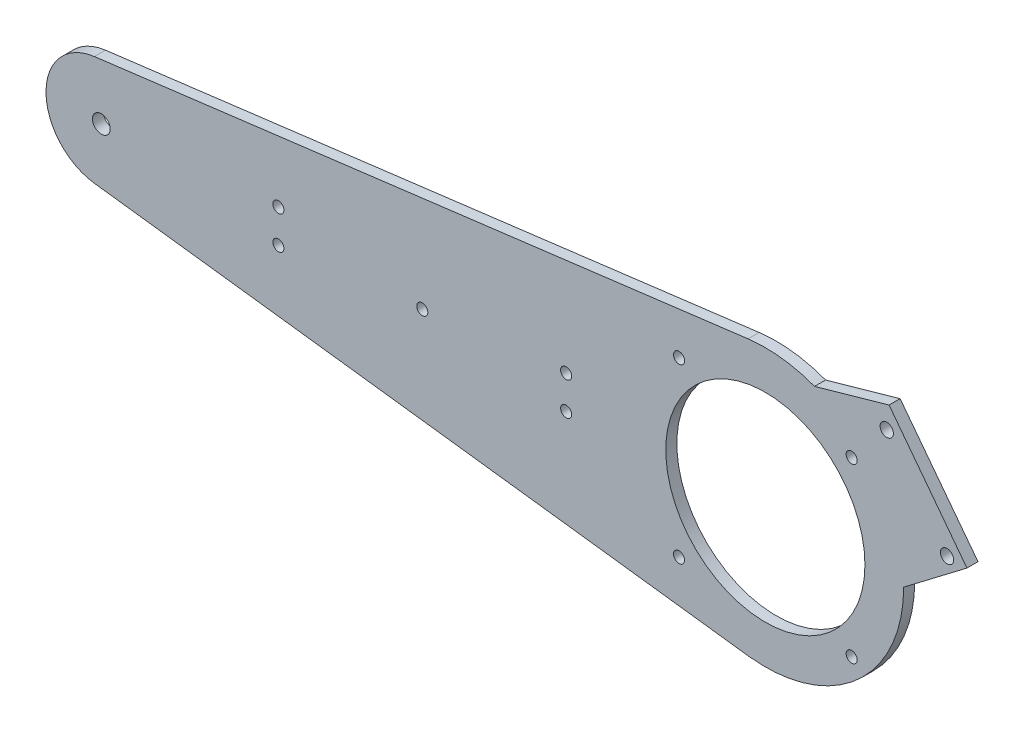
ISO-10303-21;
HEADER;
FILE_DESCRIPTION(('STEP AP214'),'2;1');
FILE_NAME('part.step','',(''),(''),'','','');
FILE_SCHEMA(('AUTOMOTIVE_DESIGN { 1 0 10303 214 1 1 1 1 }'));
ENDSEC;
DATA;
#1=APPLICATION_CONTEXT('core data for automotive mechanical design processes');
#2=APPLICATION_PROTOCOL_DEFINITION('international standard','automotive_design',2000,#1);
#3=PRODUCT_CONTEXT('',#1,'mechanical');
#4=PRODUCT('Part','Part','',(#3));
#5=PRODUCT_RELATED_PRODUCT_CATEGORY('part','',(#4));
#6=PRODUCT_DEFINITION_FORMATION('','',#4);
#7=PRODUCT_DEFINITION_CONTEXT('part definition',#1,'design');
#8=PRODUCT_DEFINITION('design','',#6,#7);
#9=PRODUCT_DEFINITION_SHAPE('','',#8);
#10=(LENGTH_UNIT() NAMED_UNIT(*) SI_UNIT(.MILLI.,.METRE.));
#11=(NAMED_UNIT(*) PLANE_ANGLE_UNIT() SI_UNIT($,.RADIAN.));
#12=(NAMED_UNIT(*) SI_UNIT($,.STERADIAN.) SOLID_ANGLE_UNIT());
#13=UNCERTAINTY_MEASURE_WITH_UNIT(LENGTH_MEASURE(1.E-05),#10,'distance_accuracy_value','');
#14=(GEOMETRIC_REPRESENTATION_CONTEXT(3) GLOBAL_UNCERTAINTY_ASSIGNED_CONTEXT((#13)) GLOBAL_UNIT_ASSIGNED_CONTEXT((#10,
#11,#12)) REPRESENTATION_CONTEXT('',''));
#15=CARTESIAN_POINT('',(0.,0.,0.));
#16=DIRECTION('',(0.,0.,1.));
#17=DIRECTION('',(1.,0.,0.));
#18=AXIS2_PLACEMENT_3D('',#15,#16,#17);
#19=CARTESIAN_POINT('',(0.,0.,5.));
#20=DIRECTION('',(0.,0.,-1.));
#21=DIRECTION('',(-1.,0.,0.));
#22=AXIS2_PLACEMENT_3D('',#19,#20,#21);
#23=CYLINDRICAL_SURFACE('',#22,62.5);
#24=CARTESIAN_POINT('',(0.,0.,5.));
#25=DIRECTION('',(0.,0.,1.));
#26=DIRECTION('',(1.,0.,0.));
#27=AXIS2_PLACEMENT_3D('',#24,#25,#26);
#28=CIRCLE('',#27,62.5);
#29=CARTESIAN_POINT('',(22.2187703705802,58.4172598058094,5.));
#30=VERTEX_POINT('',#29);
#31=CARTESIAN_POINT('',(-7.81249999999999,62.0097963530763,5.));
#32=VERTEX_POINT('',#31);
#33=EDGE_CURVE('E60',#30,#32,#28,.T.);
#34=ORIENTED_EDGE('',*,*,#33,.F.);
#35=DIRECTION('',(0.,0.,-1.));
#36=VECTOR('',#35,1.);
#37=CARTESIAN_POINT('',(22.2187703705802,58.4172598058093,101.751849564614));
#38=LINE('',#37,#36);
#39=CARTESIAN_POINT('',(22.2187703705802,58.4172598058093,0.));
#40=VERTEX_POINT('',#39);
#41=EDGE_CURVE('E52',#30,#40,#38,.T.);
#42=ORIENTED_EDGE('',*,*,#41,.T.);
#43=CARTESIAN_POINT('',(0.,0.,0.));
#44=DIRECTION('',(0.,0.,1.));
#45=DIRECTION('',(1.,0.,0.));
#46=AXIS2_PLACEMENT_3D('',#43,#44,#45);
#47=CIRCLE('',#46,62.5);
#48=CARTESIAN_POINT('',(-7.81249999999999,62.0097963530763,0.));
#49=VERTEX_POINT('',#48);
#50=EDGE_CURVE('E81',#40,#49,#47,.T.);
#51=ORIENTED_EDGE('',*,*,#50,.T.);
#52=DIRECTION('',(0.,0.,-1.));
#53=VECTOR('',#52,1.);
#54=CARTESIAN_POINT('',(-7.81249999999999,62.0097963530763,5.));
#55=LINE('',#54,#53);
#56=EDGE_CURVE('E163',#32,#49,#55,.T.);
#57=ORIENTED_EDGE('',*,*,#56,.F.);
#58=EDGE_LOOP('',(#34,#42,#51,#57));
#59=FACE_BOUND('',#58,.T.);
#60=ADVANCED_FACE('F37',(#59),#23,.T.);
#61=CARTESIAN_POINT('',(-7.81249999999999,62.0097963530763,5.));
#62=DIRECTION('',(0.125,-0.992156741649222,0.));
#63=DIRECTION('',(0.992156741649222,0.125,0.));
#64=AXIS2_PLACEMENT_3D('',#61,#62,#63);
#65=PLANE('',#64);
#66=DIRECTION('',(-0.992156741649222,-0.125,0.));
#67=VECTOR('',#66,1.);
#68=CARTESIAN_POINT('',(-7.81249999999999,62.0097963530763,0.));
#69=LINE('',#68,#67);
#70=CARTESIAN_POINT('',(-303.125,24.8039185412306,0.));
#71=VERTEX_POINT('',#70);
#72=EDGE_CURVE('E173',#49,#71,#69,.T.);
#73=ORIENTED_EDGE('',*,*,#72,.T.);
#74=DIRECTION('',(0.,0.,-1.));
#75=VECTOR('',#74,1.);
#76=CARTESIAN_POINT('',(-303.125,24.8039185412306,5.));
#77=LINE('',#76,#75);
#78=CARTESIAN_POINT('',(-303.125,24.8039185412306,5.));
#79=VERTEX_POINT('',#78);
#80=EDGE_CURVE('E11',#79,#71,#77,.T.);
#81=ORIENTED_EDGE('',*,*,#80,.F.);
#82=DIRECTION('',(-0.992156741649222,-0.125,0.));
#83=VECTOR('',#82,1.);
#84=CARTESIAN_POINT('',(-7.81249999999999,62.0097963530763,5.));
#85=LINE('',#84,#83);
#86=EDGE_CURVE('E214',#32,#79,#85,.T.);
#87=ORIENTED_EDGE('',*,*,#86,.F.);
#88=ORIENTED_EDGE('',*,*,#56,.T.);
#89=EDGE_LOOP('',(#73,#81,#87,#88));
#90=FACE_BOUND('',#89,.T.);
#91=ADVANCED_FACE('F257',(#90),#65,.F.);
#92=CARTESIAN_POINT('',(-300.,0.,5.));
#93=DIRECTION('',(0.,0.,-1.));
#94=DIRECTION('',(-1.,0.,0.));
#95=AXIS2_PLACEMENT_3D('',#92,#93,#94);
#96=CYLINDRICAL_SURFACE('',#95,25.);
#97=CARTESIAN_POINT('',(-300.,0.,0.));
#98=DIRECTION('',(0.,0.,1.));
#99=DIRECTION('',(1.,0.,0.));
#100=AXIS2_PLACEMENT_3D('',#97,#98,#99);
#101=CIRCLE('',#100,25.);
#102=CARTESIAN_POINT('',(-303.125,-24.8039185412306,0.));
#103=VERTEX_POINT('',#102);
#104=EDGE_CURVE('E172',#71,#103,#101,.T.);
#105=ORIENTED_EDGE('',*,*,#104,.T.);
#106=DIRECTION('',(0.,0.,-1.));
#107=VECTOR('',#106,1.);
#108=CARTESIAN_POINT('',(-303.125,-24.8039185412306,5.));
#109=LINE('',#108,#107);
#110=CARTESIAN_POINT('',(-303.125,-24.8039185412306,5.));
#111=VERTEX_POINT('',#110);
#112=EDGE_CURVE('E45',#111,#103,#109,.T.);
#113=ORIENTED_EDGE('',*,*,#112,.F.);
#114=CARTESIAN_POINT('',(-300.,0.,5.));
#115=DIRECTION('',(0.,0.,1.));
#116=DIRECTION('',(1.,0.,0.));
#117=AXIS2_PLACEMENT_3D('',#114,#115,#116);
#118=CIRCLE('',#117,25.);
#119=EDGE_CURVE('E88',#79,#111,#118,.T.);
#120=ORIENTED_EDGE('',*,*,#119,.F.);
#121=ORIENTED_EDGE('',*,*,#80,.T.);
#122=EDGE_LOOP('',(#105,#113,#120,#121));
#123=FACE_BOUND('',#122,.T.);
#124=ADVANCED_FACE('F278',(#123),#96,.T.);
#125=CARTESIAN_POINT('',(-7.81249999999999,-62.0097963530763,5.));
#126=DIRECTION('',(0.125,0.992156741649222,0.));
#127=DIRECTION('',(-0.992156741649222,0.125,0.));
#128=AXIS2_PLACEMENT_3D('',#125,#126,#127);
#129=PLANE('',#128);
#130=DIRECTION('',(0.992156741649222,-0.125,0.));
#131=VECTOR('',#130,1.);
#132=CARTESIAN_POINT('',(-7.81249999999999,-62.0097963530763,0.));
#133=LINE('',#132,#131);
#134=CARTESIAN_POINT('',(-7.81249999999999,-62.0097963530763,0.));
#135=VERTEX_POINT('',#134);
#136=EDGE_CURVE('E144',#103,#135,#133,.T.);
#137=ORIENTED_EDGE('',*,*,#136,.T.);
#138=DIRECTION('',(0.,0.,-1.));
#139=VECTOR('',#138,1.);
#140=CARTESIAN_POINT('',(-7.81249999999999,-62.0097963530763,5.));
#141=LINE('',#140,#139);
#142=CARTESIAN_POINT('',(-7.81249999999999,-62.0097963530763,5.));
#143=VERTEX_POINT('',#142);
#144=EDGE_CURVE('E138',#143,#135,#141,.T.);
#145=ORIENTED_EDGE('',*,*,#144,.F.);
#146=DIRECTION('',(0.992156741649222,-0.125,0.));
#147=VECTOR('',#146,1.);
#148=CARTESIAN_POINT('',(-7.81249999999999,-62.0097963530763,5.));
#149=LINE('',#148,#147);
#150=EDGE_CURVE('E170',#111,#143,#149,.T.);
#151=ORIENTED_EDGE('',*,*,#150,.F.);
#152=ORIENTED_EDGE('',*,*,#112,.T.);
#153=EDGE_LOOP('',(#137,#145,#151,#152));
#154=FACE_BOUND('',#153,.T.);
#155=ADVANCED_FACE('F169',(#154),#129,.F.);
#156=CARTESIAN_POINT('',(39.,-39.,5.));
#157=DIRECTION('',(0.,0.,-1.));
#158=DIRECTION('',(-1.,0.,0.));
#159=AXIS2_PLACEMENT_3D('',#156,#157,#158);
#160=CYLINDRICAL_SURFACE('',#159,2.5);
#161=CARTESIAN_POINT('',(39.,-39.,5.));
#162=DIRECTION('',(0.,0.,1.));
#163=DIRECTION('',(1.,0.,0.));
#164=AXIS2_PLACEMENT_3D('',#161,#162,#163);
#165=CIRCLE('',#164,2.5);
#166=CARTESIAN_POINT('',(41.5,-39.,5.));
#167=VERTEX_POINT('',#166);
#168=EDGE_CURVE('E195',#167,#167,#165,.T.);
#169=ORIENTED_EDGE('',*,*,#168,.T.);
#170=EDGE_LOOP('',(#169));
#171=FACE_BOUND('',#170,.T.);
#172=CARTESIAN_POINT('',(39.,-39.,0.));
#173=DIRECTION('',(0.,0.,1.));
#174=DIRECTION('',(1.,0.,0.));
#175=AXIS2_PLACEMENT_3D('',#172,#173,#174);
#176=CIRCLE('',#175,2.5);
#177=CARTESIAN_POINT('',(41.5,-39.,0.));
#178=VERTEX_POINT('',#177);
#179=EDGE_CURVE('E156',#178,#178,#176,.T.);
#180=ORIENTED_EDGE('',*,*,#179,.F.);
#181=EDGE_LOOP('',(#180));
#182=FACE_BOUND('',#181,.T.);
#183=ADVANCED_FACE('F308',(#171,#182),#160,.F.);
#184=CARTESIAN_POINT('',(-39.,39.,5.));
#185=DIRECTION('',(0.,0.,-1.));
#186=DIRECTION('',(-1.,0.,0.));
#187=AXIS2_PLACEMENT_3D('',#184,#185,#186);
#188=CYLINDRICAL_SURFACE('',#187,2.5);
#189=CARTESIAN_POINT('',(-39.,39.,5.));
#190=DIRECTION('',(0.,0.,1.));
#191=DIRECTION('',(1.,0.,0.));
#192=AXIS2_PLACEMENT_3D('',#189,#190,#191);
#193=CIRCLE('',#192,2.5);
#194=CARTESIAN_POINT('',(-36.5,39.,5.));
#195=VERTEX_POINT('',#194);
#196=EDGE_CURVE('E198',#195,#195,#193,.T.);
#197=ORIENTED_EDGE('',*,*,#196,.T.);
#198=EDGE_LOOP('',(#197));
#199=FACE_BOUND('',#198,.T.);
#200=CARTESIAN_POINT('',(-39.,39.,0.));
#201=DIRECTION('',(0.,0.,1.));
#202=DIRECTION('',(1.,0.,0.));
#203=AXIS2_PLACEMENT_3D('',#200,#201,#202);
#204=CIRCLE('',#203,2.5);
#205=CARTESIAN_POINT('',(-36.5,39.,0.));
#206=VERTEX_POINT('',#205);
#207=EDGE_CURVE('E153',#206,#206,#204,.T.);
#208=ORIENTED_EDGE('',*,*,#207,.F.);
#209=EDGE_LOOP('',(#208));
#210=FACE_BOUND('',#209,.T.);
#211=ADVANCED_FACE('F304',(#199,#210),#188,.F.);
#212=CARTESIAN_POINT('',(39.,39.,5.));
#213=DIRECTION('',(0.,0.,-1.));
#214=DIRECTION('',(-1.,0.,0.));
#215=AXIS2_PLACEMENT_3D('',#212,#213,#214);
#216=CYLINDRICAL_SURFACE('',#215,2.5);
#217=CARTESIAN_POINT('',(39.,39.,5.));
#218=DIRECTION('',(0.,0.,1.));
#219=DIRECTION('',(1.,0.,0.));
#220=AXIS2_PLACEMENT_3D('',#217,#218,#219);
#221=CIRCLE('',#220,2.5);
#222=CARTESIAN_POINT('',(41.5,39.,5.));
#223=VERTEX_POINT('',#222);
#224=EDGE_CURVE('E201',#223,#223,#221,.T.);
#225=ORIENTED_EDGE('',*,*,#224,.T.);
#226=EDGE_LOOP('',(#225));
#227=FACE_BOUND('',#226,.T.);
#228=CARTESIAN_POINT('',(39.,39.,0.));
#229=DIRECTION('',(0.,0.,1.));
#230=DIRECTION('',(1.,0.,0.));
#231=AXIS2_PLACEMENT_3D('',#228,#229,#230);
#232=CIRCLE('',#231,2.5);
#233=CARTESIAN_POINT('',(41.5,39.,0.));
#234=VERTEX_POINT('',#233);
#235=EDGE_CURVE('E150',#234,#234,#232,.T.);
#236=ORIENTED_EDGE('',*,*,#235,.F.);
#237=EDGE_LOOP('',(#236));
#238=FACE_BOUND('',#237,.T.);
#239=ADVANCED_FACE('F297',(#227,#238),#216,.F.);
#240=CARTESIAN_POINT('',(-39.,-39.,5.));
#241=DIRECTION('',(0.,0.,-1.));
#242=DIRECTION('',(-1.,0.,0.));
#243=AXIS2_PLACEMENT_3D('',#240,#241,#242);
#244=CYLINDRICAL_SURFACE('',#243,2.5);
#245=CARTESIAN_POINT('',(-39.,-39.,5.));
#246=DIRECTION('',(0.,0.,1.));
#247=DIRECTION('',(1.,0.,0.));
#248=AXIS2_PLACEMENT_3D('',#245,#246,#247);
#249=CIRCLE('',#248,2.5);
#250=CARTESIAN_POINT('',(-36.5,-39.,5.));
#251=VERTEX_POINT('',#250);
#252=EDGE_CURVE('E204',#251,#251,#249,.T.);
#253=ORIENTED_EDGE('',*,*,#252,.T.);
#254=EDGE_LOOP('',(#253));
#255=FACE_BOUND('',#254,.T.);
#256=CARTESIAN_POINT('',(-39.,-39.,0.));
#257=DIRECTION('',(0.,0.,1.));
#258=DIRECTION('',(1.,0.,0.));
#259=AXIS2_PLACEMENT_3D('',#256,#257,#258);
#260=CIRCLE('',#259,2.5);
#261=CARTESIAN_POINT('',(-36.5,-39.,0.));
#262=VERTEX_POINT('',#261);
#263=EDGE_CURVE('E142',#262,#262,#260,.T.);
#264=ORIENTED_EDGE('',*,*,#263,.F.);
#265=EDGE_LOOP('',(#264));
#266=FACE_BOUND('',#265,.T.);
#267=ADVANCED_FACE('F292',(#255,#266),#244,.F.);
#268=CARTESIAN_POINT('',(0.,0.,5.));
#269=DIRECTION('',(0.,0.,-1.));
#270=DIRECTION('',(-1.,0.,0.));
#271=AXIS2_PLACEMENT_3D('',#268,#269,#270);
#272=CYLINDRICAL_SURFACE('',#271,45.);
#273=CARTESIAN_POINT('',(0.,0.,5.));
#274=DIRECTION('',(0.,0.,1.));
#275=DIRECTION('',(1.,0.,0.));
#276=AXIS2_PLACEMENT_3D('',#273,#274,#275);
#277=CIRCLE('',#276,45.);
#278=CARTESIAN_POINT('',(45.,0.,5.));
#279=VERTEX_POINT('',#278);
#280=EDGE_CURVE('E207',#279,#279,#277,.T.);
#281=ORIENTED_EDGE('',*,*,#280,.T.);
#282=EDGE_LOOP('',(#281));
#283=FACE_BOUND('',#282,.T.);
#284=CARTESIAN_POINT('',(0.,0.,0.));
#285=DIRECTION('',(0.,0.,1.));
#286=DIRECTION('',(1.,0.,0.));
#287=AXIS2_PLACEMENT_3D('',#284,#285,#286);
#288=CIRCLE('',#287,45.);
#289=CARTESIAN_POINT('',(45.,0.,0.));
#290=VERTEX_POINT('',#289);
#291=EDGE_CURVE('E139',#290,#290,#288,.T.);
#292=ORIENTED_EDGE('',*,*,#291,.F.);
#293=EDGE_LOOP('',(#292));
#294=FACE_BOUND('',#293,.T.);
#295=ADVANCED_FACE('F283',(#283,#294),#272,.F.);
#296=CARTESIAN_POINT('',(62.5,0.,0.));
#297=VERTEX_POINT('',#296);
#298=EDGE_CURVE('E129',#135,#297,#47,.T.);
#299=ORIENTED_EDGE('',*,*,#298,.T.);
#300=DIRECTION('',(0.,0.,-1.));
#301=VECTOR('',#300,1.);
#302=CARTESIAN_POINT('',(62.5,0.,101.751849564614));
#303=LINE('',#302,#301);
#304=CARTESIAN_POINT('',(62.5,0.,5.));
#305=VERTEX_POINT('',#304);
#306=EDGE_CURVE('E111',#305,#297,#303,.T.);
#307=ORIENTED_EDGE('',*,*,#306,.F.);
#308=EDGE_CURVE('E210',#143,#305,#28,.T.);
#309=ORIENTED_EDGE('',*,*,#308,.F.);
#310=ORIENTED_EDGE('',*,*,#144,.T.);
#311=EDGE_LOOP('',(#299,#307,#309,#310));
#312=FACE_BOUND('',#311,.T.);
#313=ADVANCED_FACE('F136',(#312),#23,.T.);
#314=CARTESIAN_POINT('',(-90.,7.5,5.));
#315=DIRECTION('',(0.,0.,-1.));
#316=DIRECTION('',(-1.,0.,0.));
#317=AXIS2_PLACEMENT_3D('',#314,#315,#316);
#318=CYLINDRICAL_SURFACE('',#317,2.49999999999999);
#319=CARTESIAN_POINT('',(-90.,7.5,5.));
#320=DIRECTION('',(0.,0.,1.));
#321=DIRECTION('',(1.,0.,0.));
#322=AXIS2_PLACEMENT_3D('',#319,#320,#321);
#323=CIRCLE('',#322,2.49999999999999);
#324=CARTESIAN_POINT('',(-87.5,7.5,5.));
#325=VERTEX_POINT('',#324);
#326=EDGE_CURVE('E216',#325,#325,#323,.T.);
#327=ORIENTED_EDGE('',*,*,#326,.T.);
#328=EDGE_LOOP('',(#327));
#329=FACE_BOUND('',#328,.T.);
#330=CARTESIAN_POINT('',(-90.,7.5,0.));
#331=DIRECTION('',(0.,0.,1.));
#332=DIRECTION('',(1.,0.,0.));
#333=AXIS2_PLACEMENT_3D('',#330,#331,#332);
#334=CIRCLE('',#333,2.49999999999999);
#335=CARTESIAN_POINT('',(-87.5,7.5,0.));
#336=VERTEX_POINT('',#335);
#337=EDGE_CURVE('E175',#336,#336,#334,.T.);
#338=ORIENTED_EDGE('',*,*,#337,.F.);
#339=EDGE_LOOP('',(#338));
#340=FACE_BOUND('',#339,.T.);
#341=ADVANCED_FACE('F282',(#329,#340),#318,.F.);
#342=CARTESIAN_POINT('',(-90.,-7.5,5.));
#343=DIRECTION('',(0.,0.,-1.));
#344=DIRECTION('',(-1.,0.,0.));
#345=AXIS2_PLACEMENT_3D('',#342,#343,#344);
#346=CYLINDRICAL_SURFACE('',#345,2.49999999999999);
#347=CARTESIAN_POINT('',(-90.,-7.5,5.));
#348=DIRECTION('',(0.,0.,1.));
#349=DIRECTION('',(1.,0.,0.));
#350=AXIS2_PLACEMENT_3D('',#347,#348,#349);
#351=CIRCLE('',#350,2.49999999999999);
#352=CARTESIAN_POINT('',(-87.5,-7.5,5.));
#353=VERTEX_POINT('',#352);
#354=EDGE_CURVE('E219',#353,#353,#351,.T.);
#355=ORIENTED_EDGE('',*,*,#354,.T.);
#356=EDGE_LOOP('',(#355));
#357=FACE_BOUND('',#356,.T.);
#358=CARTESIAN_POINT('',(-90.,-7.5,0.));
#359=DIRECTION('',(0.,0.,1.));
#360=DIRECTION('',(1.,0.,0.));
#361=AXIS2_PLACEMENT_3D('',#358,#359,#360);
#362=CIRCLE('',#361,2.49999999999999);
#363=CARTESIAN_POINT('',(-87.5,-7.5,0.));
#364=VERTEX_POINT('',#363);
#365=EDGE_CURVE('E180',#364,#364,#362,.T.);
#366=ORIENTED_EDGE('',*,*,#365,.F.);
#367=EDGE_LOOP('',(#366));
#368=FACE_BOUND('',#367,.T.);
#369=ADVANCED_FACE('F288',(#357,#368),#346,.F.);
#370=CARTESIAN_POINT('',(-155.,0.,5.));
#371=DIRECTION('',(0.,0.,-1.));
#372=DIRECTION('',(-1.,0.,0.));
#373=AXIS2_PLACEMENT_3D('',#370,#371,#372);
#374=CYLINDRICAL_SURFACE('',#373,2.5);
#375=CARTESIAN_POINT('',(-155.,0.,5.));
#376=DIRECTION('',(0.,0.,1.));
#377=DIRECTION('',(1.,0.,0.));
#378=AXIS2_PLACEMENT_3D('',#375,#376,#377);
#379=CIRCLE('',#378,2.5);
#380=CARTESIAN_POINT('',(-152.5,0.,5.));
#381=VERTEX_POINT('',#380);
#382=EDGE_CURVE('E222',#381,#381,#379,.T.);
#383=ORIENTED_EDGE('',*,*,#382,.T.);
#384=EDGE_LOOP('',(#383));
#385=FACE_BOUND('',#384,.T.);
#386=CARTESIAN_POINT('',(-155.,0.,0.));
#387=DIRECTION('',(0.,0.,1.));
#388=DIRECTION('',(1.,0.,0.));
#389=AXIS2_PLACEMENT_3D('',#386,#387,#388);
#390=CIRCLE('',#389,2.5);
#391=CARTESIAN_POINT('',(-152.5,0.,0.));
#392=VERTEX_POINT('',#391);
#393=EDGE_CURVE('E183',#392,#392,#390,.T.);
#394=ORIENTED_EDGE('',*,*,#393,.F.);
#395=EDGE_LOOP('',(#394));
#396=FACE_BOUND('',#395,.T.);
#397=ADVANCED_FACE('F398',(#385,#396),#374,.F.);
#398=CARTESIAN_POINT('',(-220.,7.49999999999998,5.));
#399=DIRECTION('',(0.,0.,-1.));
#400=DIRECTION('',(-1.,0.,0.));
#401=AXIS2_PLACEMENT_3D('',#398,#399,#400);
#402=CYLINDRICAL_SURFACE('',#401,2.5);
#403=CARTESIAN_POINT('',(-220.,7.49999999999998,5.));
#404=DIRECTION('',(0.,0.,1.));
#405=DIRECTION('',(1.,0.,0.));
#406=AXIS2_PLACEMENT_3D('',#403,#404,#405);
#407=CIRCLE('',#406,2.5);
#408=CARTESIAN_POINT('',(-217.5,7.49999999999998,5.));
#409=VERTEX_POINT('',#408);
#410=EDGE_CURVE('E225',#409,#409,#407,.T.);
#411=ORIENTED_EDGE('',*,*,#410,.T.);
#412=EDGE_LOOP('',(#411));
#413=FACE_BOUND('',#412,.T.);
#414=CARTESIAN_POINT('',(-220.,7.49999999999998,0.));
#415=DIRECTION('',(0.,0.,1.));
#416=DIRECTION('',(1.,0.,0.));
#417=AXIS2_PLACEMENT_3D('',#414,#415,#416);
#418=CIRCLE('',#417,2.5);
#419=CARTESIAN_POINT('',(-217.5,7.49999999999998,0.));
#420=VERTEX_POINT('',#419);
#421=EDGE_CURVE('E186',#420,#420,#418,.T.);
#422=ORIENTED_EDGE('',*,*,#421,.F.);
#423=EDGE_LOOP('',(#422));
#424=FACE_BOUND('',#423,.T.);
#425=ADVANCED_FACE('F391',(#413,#424),#402,.F.);
#426=CARTESIAN_POINT('',(-220.,-7.49999999999998,5.));
#427=DIRECTION('',(0.,0.,-1.));
#428=DIRECTION('',(-1.,0.,0.));
#429=AXIS2_PLACEMENT_3D('',#426,#427,#428);
#430=CYLINDRICAL_SURFACE('',#429,2.5);
#431=CARTESIAN_POINT('',(-220.,-7.49999999999998,5.));
#432=DIRECTION('',(0.,0.,1.));
#433=DIRECTION('',(1.,0.,0.));
#434=AXIS2_PLACEMENT_3D('',#431,#432,#433);
#435=CIRCLE('',#434,2.5);
#436=CARTESIAN_POINT('',(-217.5,-7.49999999999998,5.));
#437=VERTEX_POINT('',#436);
#438=EDGE_CURVE('E162',#437,#437,#435,.T.);
#439=ORIENTED_EDGE('',*,*,#438,.T.);
#440=EDGE_LOOP('',(#439));
#441=FACE_BOUND('',#440,.T.);
#442=CARTESIAN_POINT('',(-220.,-7.49999999999998,0.));
#443=DIRECTION('',(0.,0.,1.));
#444=DIRECTION('',(1.,0.,0.));
#445=AXIS2_PLACEMENT_3D('',#442,#443,#444);
#446=CIRCLE('',#445,2.5);
#447=CARTESIAN_POINT('',(-217.5,-7.49999999999998,0.));
#448=VERTEX_POINT('',#447);
#449=EDGE_CURVE('E189',#448,#448,#446,.T.);
#450=ORIENTED_EDGE('',*,*,#449,.F.);
#451=EDGE_LOOP('',(#450));
#452=FACE_BOUND('',#451,.T.);
#453=ADVANCED_FACE('F39',(#441,#452),#430,.F.);
#454=CARTESIAN_POINT('',(-300.,0.,5.));
#455=DIRECTION('',(0.,0.,-1.));
#456=DIRECTION('',(-1.,0.,0.));
#457=AXIS2_PLACEMENT_3D('',#454,#455,#456);
#458=CYLINDRICAL_SURFACE('',#457,3.99999999999999);
#459=CARTESIAN_POINT('',(-300.,0.,5.));
#460=DIRECTION('',(0.,0.,1.));
#461=DIRECTION('',(1.,0.,0.));
#462=AXIS2_PLACEMENT_3D('',#459,#460,#461);
#463=CIRCLE('',#462,3.99999999999999);
#464=CARTESIAN_POINT('',(-296.,0.,5.));
#465=VERTEX_POINT('',#464);
#466=EDGE_CURVE('E165',#465,#465,#463,.T.);
#467=ORIENTED_EDGE('',*,*,#466,.T.);
#468=EDGE_LOOP('',(#467));
#469=FACE_BOUND('',#468,.T.);
#470=CARTESIAN_POINT('',(-300.,0.,0.));
#471=DIRECTION('',(0.,0.,1.));
#472=DIRECTION('',(1.,0.,0.));
#473=AXIS2_PLACEMENT_3D('',#470,#471,#472);
#474=CIRCLE('',#473,3.99999999999999);
#475=CARTESIAN_POINT('',(-296.,0.,0.));
#476=VERTEX_POINT('',#475);
#477=EDGE_CURVE('E159',#476,#476,#474,.T.);
#478=ORIENTED_EDGE('',*,*,#477,.F.);
#479=EDGE_LOOP('',(#478));
#480=FACE_BOUND('',#479,.T.);
#481=ADVANCED_FACE('F313',(#469,#480),#458,.F.);
#482=CARTESIAN_POINT('',(0.,0.,5.));
#483=DIRECTION('',(0.,0.,1.));
#484=DIRECTION('',(1.,0.,0.));
#485=AXIS2_PLACEMENT_3D('',#482,#483,#484);
#486=PLANE('',#485);
#487=ORIENTED_EDGE('',*,*,#308,.T.);
#488=DIRECTION('',(-0.795681377351609,-0.605715399949387,0.));
#489=VECTOR('',#488,1.);
#490=CARTESIAN_POINT('',(62.5,0.,5.));
#491=LINE('',#490,#489);
#492=CARTESIAN_POINT('',(91.0736736969158,21.7518150908067,5.));
#493=VERTEX_POINT('',#492);
#494=EDGE_CURVE('E116',#493,#305,#491,.T.);
#495=ORIENTED_EDGE('',*,*,#494,.F.);
#496=DIRECTION('',(0.605715399949387,-0.795681377351609,0.));
#497=VECTOR('',#496,1.);
#498=CARTESIAN_POINT('',(91.0736736969158,21.7518150908067,5.));
#499=LINE('',#498,#497);
#500=CARTESIAN_POINT('',(55.8898990169497,67.9700131094197,5.));
#501=VERTEX_POINT('',#500);
#502=EDGE_CURVE('E121',#501,#493,#499,.T.);
#503=ORIENTED_EDGE('',*,*,#502,.F.);
#504=DIRECTION('',(0.962032247039127,0.272935808674582,0.));
#505=VECTOR('',#504,1.);
#506=CARTESIAN_POINT('',(55.8898990169497,67.9700131094197,5.));
#507=LINE('',#506,#505);
#508=EDGE_CURVE('E234',#30,#501,#507,.T.);
#509=ORIENTED_EDGE('',*,*,#508,.F.);
#510=ORIENTED_EDGE('',*,*,#33,.T.);
#511=ORIENTED_EDGE('',*,*,#86,.T.);
#512=ORIENTED_EDGE('',*,*,#119,.T.);
#513=ORIENTED_EDGE('',*,*,#150,.T.);
#514=EDGE_LOOP('',(#487,#495,#503,#509,#510,#511,#512,#513));
#515=FACE_BOUND('',#514,.T.);
#516=ORIENTED_EDGE('',*,*,#438,.F.);
#517=EDGE_LOOP('',(#516));
#518=FACE_BOUND('',#517,.T.);
#519=ORIENTED_EDGE('',*,*,#410,.F.);
#520=EDGE_LOOP('',(#519));
#521=FACE_BOUND('',#520,.T.);
#522=ORIENTED_EDGE('',*,*,#382,.F.);
#523=EDGE_LOOP('',(#522));
#524=FACE_BOUND('',#523,.T.);
#525=ORIENTED_EDGE('',*,*,#354,.F.);
#526=EDGE_LOOP('',(#525));
#527=FACE_BOUND('',#526,.T.);
#528=ORIENTED_EDGE('',*,*,#326,.F.);
#529=EDGE_LOOP('',(#528));
#530=FACE_BOUND('',#529,.T.);
#531=ORIENTED_EDGE('',*,*,#280,.F.);
#532=EDGE_LOOP('',(#531));
#533=FACE_BOUND('',#532,.T.);
#534=ORIENTED_EDGE('',*,*,#252,.F.);
#535=EDGE_LOOP('',(#534));
#536=FACE_BOUND('',#535,.T.);
#537=ORIENTED_EDGE('',*,*,#224,.F.);
#538=EDGE_LOOP('',(#537));
#539=FACE_BOUND('',#538,.T.);
#540=ORIENTED_EDGE('',*,*,#196,.F.);
#541=EDGE_LOOP('',(#540));
#542=FACE_BOUND('',#541,.T.);
#543=ORIENTED_EDGE('',*,*,#168,.F.);
#544=EDGE_LOOP('',(#543));
#545=FACE_BOUND('',#544,.T.);
#546=ORIENTED_EDGE('',*,*,#466,.F.);
#547=EDGE_LOOP('',(#546));
#548=FACE_BOUND('',#547,.T.);
#549=CARTESIAN_POINT('',(82.098001573336,21.9398435960276,5.));
#550=DIRECTION('',(0.,0.,1.));
#551=DIRECTION('',(1.,0.,0.));
#552=AXIS2_PLACEMENT_3D('',#549,#550,#551);
#553=CIRCLE('',#552,3.00000000000001);
#554=CARTESIAN_POINT('',(79.098001573336,21.9398435960276,4.99999999999999));
#555=VERTEX_POINT('',#554);
#556=EDGE_CURVE('E133',#555,#555,#553,.F.);
#557=ORIENTED_EDGE('',*,*,#556,.T.);
#558=EDGE_LOOP('',(#557));
#559=FACE_BOUND('',#558,.T.);
#560=CARTESIAN_POINT('',(54.8408085756136,57.74550557685,5.));
#561=DIRECTION('',(0.,0.,1.));
#562=DIRECTION('',(1.,0.,0.));
#563=AXIS2_PLACEMENT_3D('',#560,#561,#562);
#564=CIRCLE('',#563,3.00000000000002);
#565=CARTESIAN_POINT('',(51.8408085756135,57.74550557685,4.99999999999999));
#566=VERTEX_POINT('',#565);
#567=EDGE_CURVE('E192',#566,#566,#564,.F.);
#568=ORIENTED_EDGE('',*,*,#567,.T.);
#569=EDGE_LOOP('',(#568));
#570=FACE_BOUND('',#569,.T.);
#571=ADVANCED_FACE('F258',(#515,#518,#521,#524,#527,#530,#533,#536,#539,#542,#545,#548,#559,
#570),#486,.T.);
#572=CARTESIAN_POINT('',(0.,0.,0.));
#573=DIRECTION('',(0.,0.,1.));
#574=DIRECTION('',(1.,0.,0.));
#575=AXIS2_PLACEMENT_3D('',#572,#573,#574);
#576=PLANE('',#575);
#577=ORIENTED_EDGE('',*,*,#50,.F.);
#578=DIRECTION('',(0.962032247039127,0.272935808674582,0.));
#579=VECTOR('',#578,1.);
#580=CARTESIAN_POINT('',(55.8898990169497,67.9700131094197,0.));
#581=LINE('',#580,#579);
#582=CARTESIAN_POINT('',(55.8898990169497,67.9700131094197,0.));
#583=VERTEX_POINT('',#582);
#584=EDGE_CURVE('E248',#40,#583,#581,.T.);
#585=ORIENTED_EDGE('',*,*,#584,.T.);
#586=DIRECTION('',(0.605715399949387,-0.795681377351609,0.));
#587=VECTOR('',#586,1.);
#588=CARTESIAN_POINT('',(91.0736736969158,21.7518150908067,0.));
#589=LINE('',#588,#587);
#590=CARTESIAN_POINT('',(91.0736736969158,21.7518150908067,0.));
#591=VERTEX_POINT('',#590);
#592=EDGE_CURVE('E132',#583,#591,#589,.T.);
#593=ORIENTED_EDGE('',*,*,#592,.T.);
#594=DIRECTION('',(-0.795681377351609,-0.605715399949387,0.));
#595=VECTOR('',#594,1.);
#596=CARTESIAN_POINT('',(62.5,0.,0.));
#597=LINE('',#596,#595);
#598=EDGE_CURVE('E115',#591,#297,#597,.T.);
#599=ORIENTED_EDGE('',*,*,#598,.T.);
#600=ORIENTED_EDGE('',*,*,#298,.F.);
#601=ORIENTED_EDGE('',*,*,#136,.F.);
#602=ORIENTED_EDGE('',*,*,#104,.F.);
#603=ORIENTED_EDGE('',*,*,#72,.F.);
#604=EDGE_LOOP('',(#577,#585,#593,#599,#600,#601,#602,#603));
#605=FACE_BOUND('',#604,.T.);
#606=ORIENTED_EDGE('',*,*,#449,.T.);
#607=EDGE_LOOP('',(#606));
#608=FACE_BOUND('',#607,.T.);
#609=ORIENTED_EDGE('',*,*,#421,.T.);
#610=EDGE_LOOP('',(#609));
#611=FACE_BOUND('',#610,.T.);
#612=ORIENTED_EDGE('',*,*,#393,.T.);
#613=EDGE_LOOP('',(#612));
#614=FACE_BOUND('',#613,.T.);
#615=ORIENTED_EDGE('',*,*,#365,.T.);
#616=EDGE_LOOP('',(#615));
#617=FACE_BOUND('',#616,.T.);
#618=ORIENTED_EDGE('',*,*,#337,.T.);
#619=EDGE_LOOP('',(#618));
#620=FACE_BOUND('',#619,.T.);
#621=ORIENTED_EDGE('',*,*,#291,.T.);
#622=EDGE_LOOP('',(#621));
#623=FACE_BOUND('',#622,.T.);
#624=ORIENTED_EDGE('',*,*,#263,.T.);
#625=EDGE_LOOP('',(#624));
#626=FACE_BOUND('',#625,.T.);
#627=ORIENTED_EDGE('',*,*,#235,.T.);
#628=EDGE_LOOP('',(#627));
#629=FACE_BOUND('',#628,.T.);
#630=ORIENTED_EDGE('',*,*,#207,.T.);
#631=EDGE_LOOP('',(#630));
#632=FACE_BOUND('',#631,.T.);
#633=ORIENTED_EDGE('',*,*,#179,.T.);
#634=EDGE_LOOP('',(#633));
#635=FACE_BOUND('',#634,.T.);
#636=ORIENTED_EDGE('',*,*,#477,.T.);
#637=EDGE_LOOP('',(#636));
#638=FACE_BOUND('',#637,.T.);
#639=CARTESIAN_POINT('',(82.098001573336,21.9398435960276,0.));
#640=DIRECTION('',(0.,0.,-1.));
#641=DIRECTION('',(-1.,0.,0.));
#642=AXIS2_PLACEMENT_3D('',#639,#640,#641);
#643=CIRCLE('',#642,3.00000000000001);
#644=CARTESIAN_POINT('',(79.098001573336,21.9398435960276,0.));
#645=VERTEX_POINT('',#644);
#646=EDGE_CURVE('E245',#645,#645,#643,.T.);
#647=ORIENTED_EDGE('',*,*,#646,.F.);
#648=EDGE_LOOP('',(#647));
#649=FACE_BOUND('',#648,.T.);
#650=CARTESIAN_POINT('',(54.8408085756136,57.74550557685,0.));
#651=DIRECTION('',(0.,0.,-1.));
#652=DIRECTION('',(-1.,0.,0.));
#653=AXIS2_PLACEMENT_3D('',#650,#651,#652);
#654=CIRCLE('',#653,3.00000000000002);
#655=CARTESIAN_POINT('',(51.8408085756135,57.74550557685,0.));
#656=VERTEX_POINT('',#655);
#657=EDGE_CURVE('E231',#656,#656,#654,.T.);
#658=ORIENTED_EDGE('',*,*,#657,.F.);
#659=EDGE_LOOP('',(#658));
#660=FACE_BOUND('',#659,.T.);
#661=ADVANCED_FACE('F126',(#605,#608,#611,#614,#617,#620,#623,#626,#629,#632,#635,#638,#649,
#660),#576,.F.);
#662=CARTESIAN_POINT('',(62.5,0.,101.751849564614));
#663=DIRECTION('',(0.605715399949387,-0.795681377351609,0.));
#664=DIRECTION('',(0.795681377351609,0.605715399949387,0.));
#665=AXIS2_PLACEMENT_3D('',#662,#663,#664);
#666=PLANE('',#665);
#667=DIRECTION('',(0.,0.,-1.));
#668=VECTOR('',#667,1.);
#669=CARTESIAN_POINT('',(91.0736736969158,21.7518150908067,101.751849564614));
#670=LINE('',#669,#668);
#671=EDGE_CURVE('E235',#493,#591,#670,.T.);
#672=ORIENTED_EDGE('',*,*,#671,.F.);
#673=ORIENTED_EDGE('',*,*,#494,.T.);
#674=ORIENTED_EDGE('',*,*,#306,.T.);
#675=ORIENTED_EDGE('',*,*,#598,.F.);
#676=EDGE_LOOP('',(#672,#673,#674,#675));
#677=FACE_BOUND('',#676,.T.);
#678=ADVANCED_FACE('F114',(#677),#666,.T.);
#679=CARTESIAN_POINT('',(91.0736736969158,21.7518150908067,101.751849564614));
#680=DIRECTION('',(0.795681377351609,0.605715399949387,0.));
#681=DIRECTION('',(-0.605715399949387,0.795681377351609,0.));
#682=AXIS2_PLACEMENT_3D('',#679,#680,#681);
#683=PLANE('',#682);
#684=DIRECTION('',(0.,0.,-1.));
#685=VECTOR('',#684,1.);
#686=CARTESIAN_POINT('',(55.8898990169497,67.9700131094197,101.751849564614));
#687=LINE('',#686,#685);
#688=EDGE_CURVE('E232',#501,#583,#687,.T.);
#689=ORIENTED_EDGE('',*,*,#688,.F.);
#690=ORIENTED_EDGE('',*,*,#502,.T.);
#691=ORIENTED_EDGE('',*,*,#671,.T.);
#692=ORIENTED_EDGE('',*,*,#592,.F.);
#693=EDGE_LOOP('',(#689,#690,#691,#692));
#694=FACE_BOUND('',#693,.T.);
#695=ADVANCED_FACE('F261',(#694),#683,.T.);
#696=CARTESIAN_POINT('',(55.8898990169497,67.9700131094197,101.751849564614));
#697=DIRECTION('',(-0.272935808674582,0.962032247039127,0.));
#698=DIRECTION('',(-0.962032247039127,-0.272935808674582,0.));
#699=AXIS2_PLACEMENT_3D('',#696,#697,#698);
#700=PLANE('',#699);
#701=ORIENTED_EDGE('',*,*,#41,.F.);
#702=ORIENTED_EDGE('',*,*,#508,.T.);
#703=ORIENTED_EDGE('',*,*,#688,.T.);
#704=ORIENTED_EDGE('',*,*,#584,.F.);
#705=EDGE_LOOP('',(#701,#702,#703,#704));
#706=FACE_BOUND('',#705,.T.);
#707=ADVANCED_FACE('F252',(#706),#700,.T.);
#708=CARTESIAN_POINT('',(54.8408085756136,57.74550557685,101.751849564614));
#709=DIRECTION('',(0.,0.,-1.));
#710=DIRECTION('',(-1.,0.,0.));
#711=AXIS2_PLACEMENT_3D('',#708,#709,#710);
#712=CYLINDRICAL_SURFACE('',#711,3.00000000000002);
#713=CARTESIAN_POINT('',(51.8408085756135,57.74550557685,0.));
#714=CARTESIAN_POINT('',(51.8408085756135,57.74550557685,0.0520833333333461));
#715=CARTESIAN_POINT('',(51.8408085756135,57.74550557685,0.104166666666678));
#716=CARTESIAN_POINT('',(51.8408085756135,57.74550557685,0.208333333333343));
#717=CARTESIAN_POINT('',(51.8408085756135,57.74550557685,0.260416666666675));
#718=CARTESIAN_POINT('',(51.8408085756135,57.74550557685,0.364583333333344));
#719=CARTESIAN_POINT('',(51.8408085756135,57.74550557685,0.416666666666681));
#720=CARTESIAN_POINT('',(51.8408085756135,57.74550557685,0.52083333333335));
#721=CARTESIAN_POINT('',(51.8408085756135,57.74550557685,0.572916666666682));
#722=CARTESIAN_POINT('',(51.8408085756135,57.74550557685,0.677083333333347));
#723=CARTESIAN_POINT('',(51.8408085756135,57.74550557685,0.729166666666679));
#724=CARTESIAN_POINT('',(51.8408085756135,57.74550557685,0.833333333333343));
#725=CARTESIAN_POINT('',(51.8408085756135,57.74550557685,0.885416666666676));
#726=CARTESIAN_POINT('',(51.8408085756135,57.74550557685,0.98958333333334));
#727=CARTESIAN_POINT('',(51.8408085756135,57.74550557685,1.04166666666667));
#728=CARTESIAN_POINT('',(51.8408085756135,57.74550557685,1.14583333333334));
#729=CARTESIAN_POINT('',(51.8408085756135,57.74550557685,1.19791666666668));
#730=CARTESIAN_POINT('',(51.8408085756135,57.74550557685,1.30208333333335));
#731=CARTESIAN_POINT('',(51.8408085756135,57.74550557685,1.35416666666668));
#732=CARTESIAN_POINT('',(51.8408085756135,57.74550557685,1.45833333333334));
#733=CARTESIAN_POINT('',(51.8408085756135,57.74550557685,1.51041666666668));
#734=CARTESIAN_POINT('',(51.8408085756135,57.74550557685,1.61458333333334));
#735=CARTESIAN_POINT('',(51.8408085756135,57.74550557685,1.66666666666667));
#736=CARTESIAN_POINT('',(51.8408085756135,57.74550557685,1.77083333333334));
#737=CARTESIAN_POINT('',(51.8408085756135,57.74550557685,1.82291666666667));
#738=CARTESIAN_POINT('',(51.8408085756135,57.74550557685,1.92708333333333));
#739=CARTESIAN_POINT('',(51.8408085756135,57.74550557685,1.97916666666667));
#740=CARTESIAN_POINT('',(51.8408085756135,57.74550557685,2.08333333333334));
#741=CARTESIAN_POINT('',(51.8408085756135,57.74550557685,2.13541666666667));
#742=CARTESIAN_POINT('',(51.8408085756135,57.74550557685,2.23958333333334));
#743=CARTESIAN_POINT('',(51.8408085756135,57.74550557685,2.29166666666667));
#744=CARTESIAN_POINT('',(51.8408085756135,57.74550557685,2.39583333333334));
#745=CARTESIAN_POINT('',(51.8408085756135,57.74550557685,2.44791666666667));
#746=CARTESIAN_POINT('',(51.8408085756135,57.74550557685,2.55208333333333));
#747=CARTESIAN_POINT('',(51.8408085756135,57.74550557685,2.60416666666667));
#748=CARTESIAN_POINT('',(51.8408085756135,57.74550557685,2.70833333333333));
#749=CARTESIAN_POINT('',(51.8408085756135,57.74550557685,2.76041666666666));
#750=CARTESIAN_POINT('',(51.8408085756135,57.74550557685,2.86458333333333));
#751=CARTESIAN_POINT('',(51.8408085756135,57.74550557685,2.91666666666667));
#752=CARTESIAN_POINT('',(51.8408085756135,57.74550557685,3.02083333333334));
#753=CARTESIAN_POINT('',(51.8408085756135,57.74550557685,3.07291666666667));
#754=CARTESIAN_POINT('',(51.8408085756135,57.74550557685,3.17708333333334));
#755=CARTESIAN_POINT('',(51.8408085756135,57.74550557685,3.22916666666667));
#756=CARTESIAN_POINT('',(51.8408085756135,57.74550557685,3.33333333333333));
#757=CARTESIAN_POINT('',(51.8408085756135,57.74550557685,3.38541666666666));
#758=CARTESIAN_POINT('',(51.8408085756135,57.74550557685,3.48958333333333));
#759=CARTESIAN_POINT('',(51.8408085756135,57.74550557685,3.54166666666666));
#760=CARTESIAN_POINT('',(51.8408085756135,57.74550557685,3.64583333333333));
#761=CARTESIAN_POINT('',(51.8408085756135,57.74550557685,3.69791666666666));
#762=CARTESIAN_POINT('',(51.8408085756135,57.74550557685,3.80208333333333));
#763=CARTESIAN_POINT('',(51.8408085756135,57.74550557685,3.85416666666666));
#764=CARTESIAN_POINT('',(51.8408085756135,57.74550557685,3.95833333333333));
#765=CARTESIAN_POINT('',(51.8408085756135,57.74550557685,4.01041666666666));
#766=CARTESIAN_POINT('',(51.8408085756135,57.74550557685,4.11458333333333));
#767=CARTESIAN_POINT('',(51.8408085756135,57.74550557685,4.16666666666666));
#768=CARTESIAN_POINT('',(51.8408085756135,57.74550557685,4.27083333333333));
#769=CARTESIAN_POINT('',(51.8408085756135,57.74550557685,4.32291666666666));
#770=CARTESIAN_POINT('',(51.8408085756135,57.74550557685,4.42708333333332));
#771=CARTESIAN_POINT('',(51.8408085756135,57.74550557685,4.47916666666665));
#772=CARTESIAN_POINT('',(51.8408085756135,57.74550557685,4.58333333333332));
#773=CARTESIAN_POINT('',(51.8408085756135,57.74550557685,4.63541666666666));
#774=CARTESIAN_POINT('',(51.8408085756135,57.74550557685,4.73958333333333));
#775=CARTESIAN_POINT('',(51.8408085756135,57.74550557685,4.79166666666666));
#776=CARTESIAN_POINT('',(51.8408085756135,57.74550557685,4.89583333333333));
#777=CARTESIAN_POINT('',(51.8408085756135,57.74550557685,4.94791666666666));
#778=CARTESIAN_POINT('',(51.8408085756135,57.74550557685,4.99999999999999));
#779=B_SPLINE_CURVE_WITH_KNOTS('',3,(#713,#714,#715,#716,#717,#718,#719,#720,#721,#722,#723,
#724,#725,#726,#727,#728,#729,#730,#731,#732,#733,#734,#735,#736,#737,#738,#739,#740,#741,#742,
#743,#744,#745,#746,#747,#748,#749,#750,#751,#752,#753,#754,#755,#756,#757,#758,#759,#760,#761,
#762,#763,#764,#765,#766,#767,#768,#769,#770,#771,#772,#773,#774,#775,#776,#777,#778),
.UNSPECIFIED.,.F.,.F.,(4,2,2,2,2,2,2,2,2,2,2,2,2,2,2,2,2,2,2,2,2,2,2,2,2,2,2,2,2,2,2,2,4),(0.,
0.156249999999997,0.312499999999993,0.468750000000004,0.625000000000001,0.781249999999997,
0.937499999999994,1.09374999999999,1.25,1.40625,1.56249999999999,1.71874999999999,
1.87499999999999,2.03124999999998,2.1875,2.34374999999999,2.49999999999999,2.65624999999998,
2.81249999999998,2.96874999999999,3.12499999999999,3.28124999999999,3.43749999999998,
3.59374999999998,3.74999999999998,3.90624999999999,4.06249999999998,4.21874999999998,
4.37499999999998,4.53124999999997,4.68749999999998,4.84374999999998,4.99999999999998),.UNSPECIFIED.);
#780=EDGE_CURVE('BSEAM268',#656,#566,#779,.T.);
#781=ORIENTED_EDGE('',*,*,#657,.T.);
#782=ORIENTED_EDGE('',*,*,#567,.F.);
#783=ORIENTED_EDGE('',*,*,#780,.T.);
#784=ORIENTED_EDGE('',*,*,#780,.F.);
#785=EDGE_LOOP('',(#781,#783,#782,#784));
#786=FACE_BOUND('',#785,.T.);
#787=ADVANCED_FACE('F268',(#786),#712,.F.);
#788=CARTESIAN_POINT('',(82.098001573336,21.9398435960276,101.751849564614));
#789=DIRECTION('',(0.,0.,-1.));
#790=DIRECTION('',(-1.,0.,0.));
#791=AXIS2_PLACEMENT_3D('',#788,#789,#790);
#792=CYLINDRICAL_SURFACE('',#791,3.00000000000001);
#793=CARTESIAN_POINT('',(79.098001573336,21.9398435960276,0.));
#794=CARTESIAN_POINT('',(79.098001573336,21.9398435960276,0.0520833333333461));
#795=CARTESIAN_POINT('',(79.098001573336,21.9398435960276,0.104166666666678));
#796=CARTESIAN_POINT('',(79.098001573336,21.9398435960276,0.208333333333343));
#797=CARTESIAN_POINT('',(79.098001573336,21.9398435960276,0.260416666666675));
#798=CARTESIAN_POINT('',(79.098001573336,21.9398435960276,0.364583333333344));
#799=CARTESIAN_POINT('',(79.098001573336,21.9398435960276,0.416666666666681));
#800=CARTESIAN_POINT('',(79.098001573336,21.9398435960276,0.52083333333335));
#801=CARTESIAN_POINT('',(79.098001573336,21.9398435960276,0.572916666666682));
#802=CARTESIAN_POINT('',(79.098001573336,21.9398435960276,0.677083333333347));
#803=CARTESIAN_POINT('',(79.098001573336,21.9398435960276,0.729166666666679));
#804=CARTESIAN_POINT('',(79.098001573336,21.9398435960276,0.833333333333343));
#805=CARTESIAN_POINT('',(79.098001573336,21.9398435960276,0.885416666666676));
#806=CARTESIAN_POINT('',(79.098001573336,21.9398435960276,0.98958333333334));
#807=CARTESIAN_POINT('',(79.098001573336,21.9398435960276,1.04166666666667));
#808=CARTESIAN_POINT('',(79.098001573336,21.9398435960276,1.14583333333334));
#809=CARTESIAN_POINT('',(79.098001573336,21.9398435960276,1.19791666666668));
#810=CARTESIAN_POINT('',(79.098001573336,21.9398435960276,1.30208333333335));
#811=CARTESIAN_POINT('',(79.098001573336,21.9398435960276,1.35416666666668));
#812=CARTESIAN_POINT('',(79.098001573336,21.9398435960276,1.45833333333334));
#813=CARTESIAN_POINT('',(79.098001573336,21.9398435960276,1.51041666666668));
#814=CARTESIAN_POINT('',(79.098001573336,21.9398435960276,1.61458333333334));
#815=CARTESIAN_POINT('',(79.098001573336,21.9398435960276,1.66666666666667));
#816=CARTESIAN_POINT('',(79.098001573336,21.9398435960276,1.77083333333334));
#817=CARTESIAN_POINT('',(79.098001573336,21.9398435960276,1.82291666666667));
#818=CARTESIAN_POINT('',(79.098001573336,21.9398435960276,1.92708333333333));
#819=CARTESIAN_POINT('',(79.098001573336,21.9398435960276,1.97916666666667));
#820=CARTESIAN_POINT('',(79.098001573336,21.9398435960276,2.08333333333334));
#821=CARTESIAN_POINT('',(79.098001573336,21.9398435960276,2.13541666666667));
#822=CARTESIAN_POINT('',(79.098001573336,21.9398435960276,2.23958333333334));
#823=CARTESIAN_POINT('',(79.098001573336,21.9398435960276,2.29166666666667));
#824=CARTESIAN_POINT('',(79.098001573336,21.9398435960276,2.39583333333334));
#825=CARTESIAN_POINT('',(79.098001573336,21.9398435960276,2.44791666666667));
#826=CARTESIAN_POINT('',(79.098001573336,21.9398435960276,2.55208333333333));
#827=CARTESIAN_POINT('',(79.098001573336,21.9398435960276,2.60416666666667));
#828=CARTESIAN_POINT('',(79.098001573336,21.9398435960276,2.70833333333333));
#829=CARTESIAN_POINT('',(79.098001573336,21.9398435960276,2.76041666666666));
#830=CARTESIAN_POINT('',(79.098001573336,21.9398435960276,2.86458333333333));
#831=CARTESIAN_POINT('',(79.098001573336,21.9398435960276,2.91666666666667));
#832=CARTESIAN_POINT('',(79.098001573336,21.9398435960276,3.02083333333334));
#833=CARTESIAN_POINT('',(79.098001573336,21.9398435960276,3.07291666666667));
#834=CARTESIAN_POINT('',(79.098001573336,21.9398435960276,3.17708333333334));
#835=CARTESIAN_POINT('',(79.098001573336,21.9398435960276,3.22916666666667));
#836=CARTESIAN_POINT('',(79.098001573336,21.9398435960276,3.33333333333333));
#837=CARTESIAN_POINT('',(79.098001573336,21.9398435960276,3.38541666666666));
#838=CARTESIAN_POINT('',(79.098001573336,21.9398435960276,3.48958333333333));
#839=CARTESIAN_POINT('',(79.098001573336,21.9398435960276,3.54166666666666));
#840=CARTESIAN_POINT('',(79.098001573336,21.9398435960276,3.64583333333333));
#841=CARTESIAN_POINT('',(79.098001573336,21.9398435960276,3.69791666666666));
#842=CARTESIAN_POINT('',(79.098001573336,21.9398435960276,3.80208333333333));
#843=CARTESIAN_POINT('',(79.098001573336,21.9398435960276,3.85416666666666));
#844=CARTESIAN_POINT('',(79.098001573336,21.9398435960276,3.95833333333333));
#845=CARTESIAN_POINT('',(79.098001573336,21.9398435960276,4.01041666666666));
#846=CARTESIAN_POINT('',(79.098001573336,21.9398435960276,4.11458333333333));
#847=CARTESIAN_POINT('',(79.098001573336,21.9398435960276,4.16666666666666));
#848=CARTESIAN_POINT('',(79.098001573336,21.9398435960276,4.27083333333333));
#849=CARTESIAN_POINT('',(79.098001573336,21.9398435960276,4.32291666666666));
#850=CARTESIAN_POINT('',(79.098001573336,21.9398435960276,4.42708333333332));
#851=CARTESIAN_POINT('',(79.098001573336,21.9398435960276,4.47916666666665));
#852=CARTESIAN_POINT('',(79.098001573336,21.9398435960276,4.58333333333332));
#853=CARTESIAN_POINT('',(79.098001573336,21.9398435960276,4.63541666666666));
#854=CARTESIAN_POINT('',(79.098001573336,21.9398435960276,4.73958333333333));
#855=CARTESIAN_POINT('',(79.098001573336,21.9398435960276,4.79166666666666));
#856=CARTESIAN_POINT('',(79.098001573336,21.9398435960276,4.89583333333333));
#857=CARTESIAN_POINT('',(79.098001573336,21.9398435960276,4.94791666666666));
#858=CARTESIAN_POINT('',(79.098001573336,21.9398435960276,4.99999999999999));
#859=B_SPLINE_CURVE_WITH_KNOTS('',3,(#793,#794,#795,#796,#797,#798,#799,#800,#801,#802,#803,
#804,#805,#806,#807,#808,#809,#810,#811,#812,#813,#814,#815,#816,#817,#818,#819,#820,#821,#822,
#823,#824,#825,#826,#827,#828,#829,#830,#831,#832,#833,#834,#835,#836,#837,#838,#839,#840,#841,
#842,#843,#844,#845,#846,#847,#848,#849,#850,#851,#852,#853,#854,#855,#856,#857,#858),
.UNSPECIFIED.,.F.,.F.,(4,2,2,2,2,2,2,2,2,2,2,2,2,2,2,2,2,2,2,2,2,2,2,2,2,2,2,2,2,2,2,2,4),(0.,
0.156249999999997,0.312499999999993,0.468750000000004,0.625000000000001,0.781249999999997,
0.937499999999994,1.09374999999999,1.25,1.40625,1.56249999999999,1.71874999999999,
1.87499999999999,2.03124999999998,2.1875,2.34374999999999,2.49999999999999,2.65624999999998,
2.81249999999998,2.96874999999999,3.12499999999999,3.28124999999999,3.43749999999998,
3.59374999999998,3.74999999999998,3.90624999999999,4.06249999999998,4.21874999999998,
4.37499999999998,4.53124999999997,4.68749999999998,4.84374999999998,4.99999999999998),.UNSPECIFIED.);
#860=EDGE_CURVE('BSEAM321',#645,#555,#859,.T.);
#861=ORIENTED_EDGE('',*,*,#646,.T.);
#862=ORIENTED_EDGE('',*,*,#556,.F.);
#863=ORIENTED_EDGE('',*,*,#860,.T.);
#864=ORIENTED_EDGE('',*,*,#860,.F.);
#865=EDGE_LOOP('',(#861,#863,#862,#864));
#866=FACE_BOUND('',#865,.T.);
#867=ADVANCED_FACE('F321',(#866),#792,.F.);
#868=CLOSED_SHELL('',(#60,#91,#124,#155,#183,#211,#239,#267,#295,#313,#341,#369,#397,#425,#453,
#481,#571,#661,#678,#695,#707,#787,#867));
#869=MANIFOLD_SOLID_BREP('B2',#868);
#870=ADVANCED_BREP_SHAPE_REPRESENTATION('',(#18,#869),#14);
#871=SHAPE_DEFINITION_REPRESENTATION(#9,#870);
ENDSEC;
END-ISO-10303-21;
